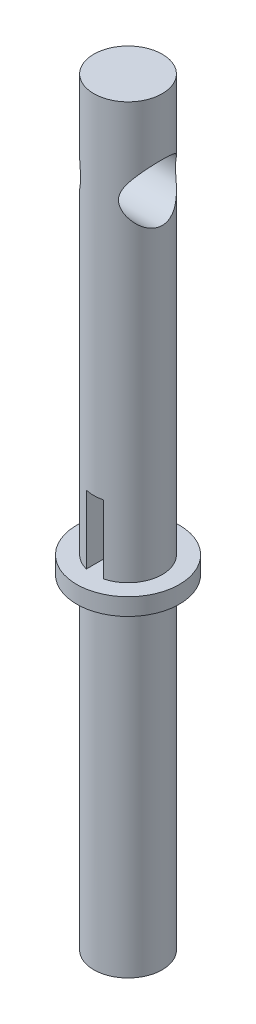
ISO-10303-21;
HEADER;
FILE_DESCRIPTION(('STEP AP214'),'2;1');
FILE_NAME('part.step','',(''),(''),'','','');
FILE_SCHEMA(('AUTOMOTIVE_DESIGN { 1 0 10303 214 1 1 1 1 }'));
ENDSEC;
DATA;
#1=APPLICATION_CONTEXT('core data for automotive mechanical design processes');
#2=APPLICATION_PROTOCOL_DEFINITION('international standard','automotive_design',2000,#1);
#3=PRODUCT_CONTEXT('',#1,'mechanical');
#4=PRODUCT('Part','Part','',(#3));
#5=PRODUCT_RELATED_PRODUCT_CATEGORY('part','',(#4));
#6=PRODUCT_DEFINITION_FORMATION('','',#4);
#7=PRODUCT_DEFINITION_CONTEXT('part definition',#1,'design');
#8=PRODUCT_DEFINITION('design','',#6,#7);
#9=PRODUCT_DEFINITION_SHAPE('','',#8);
#10=(LENGTH_UNIT() NAMED_UNIT(*) SI_UNIT(.MILLI.,.METRE.));
#11=(NAMED_UNIT(*) PLANE_ANGLE_UNIT() SI_UNIT($,.RADIAN.));
#12=(NAMED_UNIT(*) SI_UNIT($,.STERADIAN.) SOLID_ANGLE_UNIT());
#13=UNCERTAINTY_MEASURE_WITH_UNIT(LENGTH_MEASURE(1.E-05),#10,'distance_accuracy_value','');
#14=(GEOMETRIC_REPRESENTATION_CONTEXT(3) GLOBAL_UNCERTAINTY_ASSIGNED_CONTEXT((#13)) GLOBAL_UNIT_ASSIGNED_CONTEXT((#10,
#11,#12)) REPRESENTATION_CONTEXT('',''));
#15=CARTESIAN_POINT('',(0.,0.,0.));
#16=DIRECTION('',(0.,0.,1.));
#17=DIRECTION('',(1.,0.,0.));
#18=AXIS2_PLACEMENT_3D('',#15,#16,#17);
#19=CARTESIAN_POINT('',(0.,100.,0.));
#20=DIRECTION('',(0.,-1.,0.));
#21=DIRECTION('',(0.,0.,-1.));
#22=AXIS2_PLACEMENT_3D('',#19,#20,#21);
#23=CYLINDRICAL_SURFACE('',#22,6.);
#24=CARTESIAN_POINT('',(-3.3166247903554,118.,-5.));
#25=CARTESIAN_POINT('',(-3.31662794476975,118.088357331619,-4.99999873669809));
#26=CARTESIAN_POINT('',(-3.32017760246918,118.17674313147,-4.99764949990447));
#27=CARTESIAN_POINT('',(-3.33417045527444,118.352735942958,-4.98832325896171));
#28=CARTESIAN_POINT('',(-3.3446180998479,118.440342414908,-4.98134326778329));
#29=CARTESIAN_POINT('',(-3.38563021825916,118.701381115052,-4.95364903692459));
#30=CARTESIAN_POINT('',(-3.42586057200478,118.872671192586,-4.92618156230664));
#31=CARTESIAN_POINT('',(-3.5101558406814,119.15477857127,-4.8662676184845));
#32=CARTESIAN_POINT('',(-3.54929709438413,119.26808765609,-4.83790385903172));
#33=CARTESIAN_POINT('',(-3.63452822238789,119.490054140229,-4.77420588995433));
#34=CARTESIAN_POINT('',(-3.68061881422353,119.59871105771,-4.73887096042456));
#35=CARTESIAN_POINT('',(-3.77796853322909,119.811644554045,-4.66163300443267));
#36=CARTESIAN_POINT('',(-3.82924235518146,119.915907420314,-4.61971110606069));
#37=CARTESIAN_POINT('',(-3.93525823032698,120.119866277973,-4.52974410509653));
#38=CARTESIAN_POINT('',(-3.98999948308477,120.219563314267,-4.48170041311137));
#39=CARTESIAN_POINT('',(-4.12658292854895,120.458064552314,-4.35697668331641));
#40=CARTESIAN_POINT('',(-4.20963305622118,120.59450175216,-4.27707506631861));
#41=CARTESIAN_POINT('',(-4.37734960453414,120.858595640594,-4.10527119440744));
#42=CARTESIAN_POINT('',(-4.46201670619971,120.986248520416,-4.01336378337446));
#43=CARTESIAN_POINT('',(-4.63048997394915,121.232567906254,-3.81774867232316));
#44=CARTESIAN_POINT('',(-4.71429685905414,121.351242554597,-3.71405188298723));
#45=CARTESIAN_POINT('',(-4.87900188054922,121.579225014062,-3.49487447811016));
#46=CARTESIAN_POINT('',(-4.95990111064141,121.688536369009,-3.37939835739528));
#47=CARTESIAN_POINT('',(-5.16206895424223,121.95710777221,-3.06673100282964));
#48=CARTESIAN_POINT('',(-5.27982320972113,122.108976821495,-2.86071294008215));
#49=CARTESIAN_POINT('',(-5.4955407376141,122.382693706399,-2.42053048533954));
#50=CARTESIAN_POINT('',(-5.593536018849,122.504590168,-2.18641261186313));
#51=CARTESIAN_POINT('',(-5.74745712484945,122.69422711566,-1.7358252437812));
#52=CARTESIAN_POINT('',(-5.80772673614349,122.76768639697,-1.52329920748389));
#53=CARTESIAN_POINT('',(-5.88086312369275,122.856420576205,-1.19502628232578));
#54=CARTESIAN_POINT('',(-5.90236752178028,122.882427127586,-1.08398885378293));
#55=CARTESIAN_POINT('',(-5.93921712526113,122.926911634562,-0.859429029159067));
#56=CARTESIAN_POINT('',(-5.95456484023729,122.945392657753,-0.745907665517421));
#57=CARTESIAN_POINT('',(-5.97882939527611,122.9745820386,-0.516669986290209));
#58=CARTESIAN_POINT('',(-5.98771730317482,122.985255428814,-0.400946149218998));
#59=CARTESIAN_POINT('',(-5.99875382699587,122.998505894175,-0.168711507254269));
#60=CARTESIAN_POINT('',(-6.00090242912464,123.001082952753,-0.0522007007505217));
#61=CARTESIAN_POINT('',(-5.99841018407049,122.998092172682,0.180640612720631));
#62=CARTESIAN_POINT('',(-5.99376943883931,122.99252445634,0.296971122369191));
#63=CARTESIAN_POINT('',(-5.97780528304919,122.973347373147,0.528497640320092));
#64=CARTESIAN_POINT('',(-5.96648210073922,122.959738280963,0.643693687235134));
#65=CARTESIAN_POINT('',(-5.93838432928764,122.925900046649,0.864356619363596));
#66=CARTESIAN_POINT('',(-5.9220290408177,122.906179448638,0.969955578180804));
#67=CARTESIAN_POINT('',(-5.88402713952791,122.860240700624,1.1787736925959));
#68=CARTESIAN_POINT('',(-5.86237875386122,122.834020373589,1.28199203813953));
#69=CARTESIAN_POINT('',(-5.79004001335747,122.746123542295,1.58714445298207));
#70=CARTESIAN_POINT('',(-5.73193253821424,122.675183145112,1.78475392929081));
#71=CARTESIAN_POINT('',(-5.59380617850915,122.504815449882,2.18109489736997));
#72=CARTESIAN_POINT('',(-5.51233775066247,122.403469887338,2.37847529507846));
#73=CARTESIAN_POINT('',(-5.33487872344963,122.179193176341,2.75357057398256));
#74=CARTESIAN_POINT('',(-5.23887508225461,122.056242626577,2.93126754359993));
#75=CARTESIAN_POINT('',(-5.06345256362711,121.826552681739,3.22215723430855));
#76=CARTESIAN_POINT('',(-4.98626319074506,121.723983814923,3.34006525019963));
#77=CARTESIAN_POINT('',(-4.82829724388018,121.509659563431,3.56460009113998));
#78=CARTESIAN_POINT('',(-4.74752055452731,121.397903883205,3.67122655299482));
#79=CARTESIAN_POINT('',(-4.58410798881026,121.165577762687,3.87335486662883));
#80=CARTESIAN_POINT('',(-4.50146897844421,121.044991553801,3.96883598706688));
#81=CARTESIAN_POINT('',(-4.33655118512333,120.79543654578,4.14839258047199));
#82=CARTESIAN_POINT('',(-4.25427228300422,120.666470785426,4.23247215435344));
#83=CARTESIAN_POINT('',(-4.1140537410506,120.435458883206,4.36822595130953));
#84=CARTESIAN_POINT('',(-4.05545922530511,120.335372164501,4.42257235849338));
#85=CARTESIAN_POINT('',(-3.94102466938531,120.130470943921,4.52484320866562));
#86=CARTESIAN_POINT('',(-3.88518394975591,120.025657620601,4.57276924083878));
#87=CARTESIAN_POINT('',(-3.77786515537514,119.811310149254,4.6618221652177));
#88=CARTESIAN_POINT('',(-3.72637785846063,119.701786761803,4.7029636149486));
#89=CARTESIAN_POINT('',(-3.62953832593278,119.477757684949,4.77809629923187));
#90=CARTESIAN_POINT('',(-3.58418315976846,119.363254410268,4.81209095358585));
#91=CARTESIAN_POINT('',(-3.48752939102618,119.088380736585,4.88281523848206));
#92=CARTESIAN_POINT('',(-3.43964173138412,118.925897664081,4.91639072302862));
#93=CARTESIAN_POINT('',(-3.3840294682241,118.67691440476,4.95467936927281));
#94=CARTESIAN_POINT('',(-3.36819980713385,118.593094427593,4.96542704017027));
#95=CARTESIAN_POINT('',(-3.34259187408394,118.424119901189,4.98270218202997));
#96=CARTESIAN_POINT('',(-3.33281063445973,118.338966027492,4.98923172269279));
#97=CARTESIAN_POINT('',(-3.31972939847515,118.167284205897,4.99794561301055));
#98=CARTESIAN_POINT('',(-3.31647910249414,118.080750735018,5.00009664387433));
#99=CARTESIAN_POINT('',(-3.31678052916364,117.907702623172,4.99989668987805));
#100=CARTESIAN_POINT('',(-3.32033209207776,117.82118798181,4.99754581074186));
#101=CARTESIAN_POINT('',(-3.33405478268835,117.648845329324,4.98840108067787));
#102=CARTESIAN_POINT('',(-3.3442323451194,117.563018067842,4.98160291080297));
#103=CARTESIAN_POINT('',(-3.37071006080502,117.392735068692,4.96372506243882));
#104=CARTESIAN_POINT('',(-3.38701365331434,117.308280129305,4.95264297878864));
#105=CARTESIAN_POINT('',(-3.42981531688948,117.120231607996,4.92312920097745));
#106=CARTESIAN_POINT('',(-3.45784615150595,117.017167689583,4.90354996537012));
#107=CARTESIAN_POINT('',(-3.52082821574175,116.814446746996,4.85852481786918));
#108=CARTESIAN_POINT('',(-3.55578533317365,116.714792706558,4.83307391160853));
#109=CARTESIAN_POINT('',(-3.63118441347009,116.518885870487,4.77668497524491));
#110=CARTESIAN_POINT('',(-3.67164057148062,116.422642718162,4.74573267813381));
#111=CARTESIAN_POINT('',(-3.75661784436826,116.233852669996,4.67875547309408));
#112=CARTESIAN_POINT('',(-3.8011378410032,116.141304767354,4.6427319591363));
#113=CARTESIAN_POINT('',(-3.9193288291265,115.908046953392,4.54397265387661));
#114=CARTESIAN_POINT('',(-3.99516418797812,115.769919398337,4.47770636941178));
#115=CARTESIAN_POINT('',(-4.15071747665806,115.501932122123,4.33391164170773));
#116=CARTESIAN_POINT('',(-4.23043739702728,115.37207672014,4.25637738328216));
#117=CARTESIAN_POINT('',(-4.39127806383227,115.120294254834,4.09024004761838));
#118=CARTESIAN_POINT('',(-4.47240035029541,114.998376714554,4.00162403459399));
#119=CARTESIAN_POINT('',(-4.63384848035869,114.762731735844,3.81350438629227));
#120=CARTESIAN_POINT('',(-4.71417447436776,114.649002724275,3.71400285158992));
#121=CARTESIAN_POINT('',(-4.87425051167097,114.427277378878,3.50140550373499));
#122=CARTESIAN_POINT('',(-4.95393296540457,114.319502834655,3.38802651923032));
#123=CARTESIAN_POINT('',(-5.10871337759375,114.113671449091,3.14979793373936));
#124=CARTESIAN_POINT('',(-5.1838104886944,114.015616401804,3.02494622324846));
#125=CARTESIAN_POINT('',(-5.32734082462683,113.830592947242,2.7643281899541));
#126=CARTESIAN_POINT('',(-5.39579241721445,113.743593763711,2.62859396116225));
#127=CARTESIAN_POINT('',(-5.52435553294335,113.581751703963,2.34638028849616));
#128=CARTESIAN_POINT('',(-5.58447198962522,113.50690163221,2.19990728004665));
#129=CARTESIAN_POINT('',(-5.67617962065393,113.393512899591,1.94745044116202));
#130=CARTESIAN_POINT('',(-5.71061150195714,113.351173133296,1.84418602584183));
#131=CARTESIAN_POINT('',(-5.77435694644316,113.273086882035,1.6336724739409));
#132=CARTESIAN_POINT('',(-5.80367190661344,113.237338597356,1.52642443467048));
#133=CARTESIAN_POINT('',(-5.85665652035681,113.17291380295,1.30849019874867));
#134=CARTESIAN_POINT('',(-5.88032771684104,113.144235360373,1.19780495114685));
#135=CARTESIAN_POINT('',(-5.92156299248418,113.094380295454,0.973686630752035));
#136=CARTESIAN_POINT('',(-5.93912985749711,113.07320025096,0.860254836759139));
#137=CARTESIAN_POINT('',(-5.96787674727979,113.038584222936,0.630783080696449));
#138=CARTESIAN_POINT('',(-5.97902233359909,113.025189992737,0.514732461396216));
#139=CARTESIAN_POINT('',(-5.9945277383302,113.006565361142,0.281570670545718));
#140=CARTESIAN_POINT('',(-5.99889027069058,113.001331694644,0.164459942026936));
#141=CARTESIAN_POINT('',(-6.00073725326668,112.999115279661,-0.0699121411589829));
#142=CARTESIAN_POINT('',(-5.99822064385191,113.002133802304,-0.187173516250183));
#143=CARTESIAN_POINT('',(-5.98636592157636,113.016367555496,-0.420843634561557));
#144=CARTESIAN_POINT('',(-5.97702808694249,113.027582451727,-0.53725241236222));
#145=CARTESIAN_POINT('',(-5.95266735271363,113.056892667466,-0.759836291993555));
#146=CARTESIAN_POINT('',(-5.93811010610557,113.07442488611,-0.866137262020909));
#147=CARTESIAN_POINT('',(-5.90359345775074,113.116092798666,-1.07655589912361));
#148=CARTESIAN_POINT('',(-5.8836323337842,113.140230597807,-1.18067285873536));
#149=CARTESIAN_POINT('',(-5.81615311526212,113.222070719172,-1.48877367881909));
#150=CARTESIAN_POINT('',(-5.76101886378346,113.289223927613,-1.68868566836377));
#151=CARTESIAN_POINT('',(-5.62928736591246,113.451235770944,-2.08770893335346));
#152=CARTESIAN_POINT('',(-5.55142386318964,113.547750060002,-2.28571139482501));
#153=CARTESIAN_POINT('',(-5.38078021290574,113.762423360407,-2.66271401761202));
#154=CARTESIAN_POINT('',(-5.28798857113482,113.880599060226,-2.84169935856695));
#155=CARTESIAN_POINT('',(-5.11764052278972,114.102071147992,-3.13537854219948));
#156=CARTESIAN_POINT('',(-5.04243215748708,114.201196026972,-3.25465683969472));
#157=CARTESIAN_POINT('',(-4.88807269926615,114.408612723105,-3.48218762121494));
#158=CARTESIAN_POINT('',(-4.80892152227757,114.51690473576,-3.59043986998786));
#159=CARTESIAN_POINT('',(-4.64829669559423,114.74225136513,-3.79610354841702));
#160=CARTESIAN_POINT('',(-4.56681845260902,114.859324177984,-3.89349136454398));
#161=CARTESIAN_POINT('',(-4.4036448915909,115.101701356768,-4.07712890054708));
#162=CARTESIAN_POINT('',(-4.32194964830251,115.227003171425,-4.1633820481851));
#163=CARTESIAN_POINT('',(-4.17813106947155,115.457748618697,-4.30711013423563));
#164=CARTESIAN_POINT('',(-4.11561154336174,115.561592522764,-4.36676620571679));
#165=CARTESIAN_POINT('',(-3.99314168453422,115.774516514727,-4.47903059796963));
#166=CARTESIAN_POINT('',(-3.93319164260328,115.883597192319,-4.53163812248679));
#167=CARTESIAN_POINT('',(-3.81764974603368,116.106971138512,-4.62939117572733));
#168=CARTESIAN_POINT('',(-3.7620486836104,116.221252536595,-4.67455270718897));
#169=CARTESIAN_POINT('',(-3.65718908304626,116.455332200692,-4.75703840843708));
#170=CARTESIAN_POINT('',(-3.60792687428371,116.575127218884,-4.79436712192207));
#171=CARTESIAN_POINT('',(-3.50393713411263,116.85974301565,-4.87112383115559));
#172=CARTESIAN_POINT('',(-3.45249622153167,117.026715860445,-4.90740860229219));
#173=CARTESIAN_POINT('',(-3.39225340367089,117.282873939422,-4.94906155040725));
#174=CARTESIAN_POINT('',(-3.37500354661876,117.369095607749,-4.96080991746183));
#175=CARTESIAN_POINT('',(-3.34685992066568,117.54304020515,-4.97984154687568));
#176=CARTESIAN_POINT('',(-3.33596181327638,117.63076206728,-4.98712785716359));
#177=CARTESIAN_POINT('',(-3.32457244302594,117.765576628857,-4.99472098046215));
#178=CARTESIAN_POINT('',(-3.32159733493985,117.812382029319,-4.99669862748169));
#179=CARTESIAN_POINT('',(-3.3176224863153,117.906122259661,-4.9993385955846));
#180=CARTESIAN_POINT('',(-3.31662311446369,117.953057112062,-5.00000067117283));
#181=CARTESIAN_POINT('',(-3.3166247903554,118.,-5.));
#182=B_SPLINE_CURVE_WITH_KNOTS('',3,(#24,#25,#26,#27,#28,#29,#30,#31,#32,#33,#34,#35,#36,#37,
#38,#39,#40,#41,#42,#43,#44,#45,#46,#47,#48,#49,#50,#51,#52,#53,#54,#55,#56,#57,#58,#59,#60,#61,
#62,#63,#64,#65,#66,#67,#68,#69,#70,#71,#72,#73,#74,#75,#76,#77,#78,#79,#80,#81,#82,#83,#84,#85,
#86,#87,#88,#89,#90,#91,#92,#93,#94,#95,#96,#97,#98,#99,#100,#101,#102,#103,#104,#105,#106,#107,
#108,#109,#110,#111,#112,#113,#114,#115,#116,#117,#118,#119,#120,#121,#122,#123,#124,#125,#126,
#127,#128,#129,#130,#131,#132,#133,#134,#135,#136,#137,#138,#139,#140,#141,#142,#143,#144,#145,
#146,#147,#148,#149,#150,#151,#152,#153,#154,#155,#156,#157,#158,#159,#160,#161,#162,#163,#164,
#165,#166,#167,#168,#169,#170,#171,#172,#173,#174,#175,#176,#177,#178,#179,#180,#181),
.UNSPECIFIED.,.T.,.F.,(4,2,2,2,2,2,2,2,2,2,2,2,2,2,2,2,2,2,2,2,2,2,2,2,2,2,2,2,2,2,2,2,2,2,2,2,
2,2,2,2,2,2,2,2,2,2,2,2,2,2,2,2,2,2,2,2,2,2,2,2,2,2,2,2,2,2,2,2,2,2,2,2,2,2,2,2,2,2,4),(0.,
0.26501395281901,0.530199017087531,1.06163719911786,1.43076789442494,1.79993672943004,
2.17018320936787,2.54034452945808,3.07543019863954,3.61074643087442,4.14557121755988,
4.68019268072497,5.52201270319165,6.36245785313038,7.05764252128531,7.40543000351037,
7.75307557644038,8.10226874637167,8.45146263100875,8.80065127205551,9.14982798671478,
9.47544830739571,9.80117783968312,10.452097720823,11.1587200789086,11.8659802583275,
12.3882608741328,12.9105582989455,13.433812263902,13.9568775225451,14.3408709272065,
14.7247691086984,15.1078325378949,15.4907122487077,16.0066331878932,16.2642904978429,
16.5218212874357,16.7813045706502,17.0407817601757,17.3005113135066,17.5603869017104,
17.8856330794899,18.2111569341447,18.5375376410063,18.863828807222,19.3759116451388,
19.8882597039456,20.4012115116443,20.9140645092449,21.4400687075238,21.9661698171289,
22.4907727486829,23.0150638316062,23.3651335641894,23.7151075730876,24.0649857949239,
24.4147041313182,24.7662810155411,25.1177171950979,25.4692075112737,25.8206834915196,
26.1464577543446,26.4723359641474,27.1235556931919,27.8219883018054,28.5209612788415,
29.0374312101589,29.5539121585846,30.0714946488292,30.5889174215277,30.9939304204943,
31.3989891341328,31.8031656262596,32.2071070096085,32.7401711696446,33.0060225378416,
33.2716921059159,33.4124636663662,33.5532614933412),.UNSPECIFIED.);
#183=CARTESIAN_POINT('',(-3.3166247903554,118.,-5.));
#184=VERTEX_POINT('',#183);
#185=EDGE_CURVE('E50',#184,#184,#182,.T.);
#186=ORIENTED_EDGE('',*,*,#185,.T.);
#187=EDGE_LOOP('',(#186));
#188=FACE_BOUND('',#187,.T.);
#189=CARTESIAN_POINT('',(3.3166247903554,118.,-5.));
#190=CARTESIAN_POINT('',(3.31662794476975,117.911642668381,-4.99999873669809));
#191=CARTESIAN_POINT('',(3.32017760246918,117.82325686853,-4.99764949990447));
#192=CARTESIAN_POINT('',(3.33417045527444,117.647264057042,-4.98832325896171));
#193=CARTESIAN_POINT('',(3.3446180998479,117.559657585092,-4.98134326778329));
#194=CARTESIAN_POINT('',(3.38563021825916,117.298618884948,-4.95364903692459));
#195=CARTESIAN_POINT('',(3.42586057200478,117.127328807414,-4.92618156230664));
#196=CARTESIAN_POINT('',(3.5101558406814,116.84522142873,-4.8662676184845));
#197=CARTESIAN_POINT('',(3.54929709438413,116.73191234391,-4.83790385903172));
#198=CARTESIAN_POINT('',(3.63452822238789,116.509945859771,-4.77420588995433));
#199=CARTESIAN_POINT('',(3.68061881422353,116.40128894229,-4.73887096042456));
#200=CARTESIAN_POINT('',(3.7779685332291,116.188355445955,-4.66163300443266));
#201=CARTESIAN_POINT('',(3.82924235518147,116.084092579686,-4.61971110606068));
#202=CARTESIAN_POINT('',(3.93525823032699,115.880133722027,-4.52974410509652));
#203=CARTESIAN_POINT('',(3.98999948308478,115.780436685733,-4.48170041311136));
#204=CARTESIAN_POINT('',(4.12658292854895,115.541935447686,-4.35697668331641));
#205=CARTESIAN_POINT('',(4.20963305622118,115.40549824784,-4.27707506631861));
#206=CARTESIAN_POINT('',(4.37734960453414,115.141404359406,-4.10527119440744));
#207=CARTESIAN_POINT('',(4.46201670619972,115.013751479584,-4.01336378337446));
#208=CARTESIAN_POINT('',(4.63048997394915,114.767432093746,-3.81774867232316));
#209=CARTESIAN_POINT('',(4.71429685905414,114.648757445403,-3.71405188298723));
#210=CARTESIAN_POINT('',(4.87900188054922,114.420774985938,-3.49487447811017));
#211=CARTESIAN_POINT('',(4.9599011106414,114.311463630991,-3.37939835739529));
#212=CARTESIAN_POINT('',(5.16206895424223,114.04289222779,-3.06673100282964));
#213=CARTESIAN_POINT('',(5.27982320972113,113.891023178505,-2.86071294008215));
#214=CARTESIAN_POINT('',(5.4955407376141,113.617306293601,-2.42053048533954));
#215=CARTESIAN_POINT('',(5.593536018849,113.495409832,-2.18641261186313));
#216=CARTESIAN_POINT('',(5.74745712484945,113.30577288434,-1.7358252437812));
#217=CARTESIAN_POINT('',(5.80772673614349,113.23231360303,-1.52329920748389));
#218=CARTESIAN_POINT('',(5.88086312369275,113.143579423795,-1.19502628232578));
#219=CARTESIAN_POINT('',(5.90236752178028,113.117572872414,-1.08398885378294));
#220=CARTESIAN_POINT('',(5.93921712526113,113.073088365438,-0.859429029159074));
#221=CARTESIAN_POINT('',(5.95456484023729,113.054607342247,-0.745907665517424));
#222=CARTESIAN_POINT('',(5.97882939527611,113.0254179614,-0.51666998629021));
#223=CARTESIAN_POINT('',(5.98771730317482,113.014744571186,-0.400946149218999));
#224=CARTESIAN_POINT('',(5.99875382699587,113.001494105825,-0.168711507254271));
#225=CARTESIAN_POINT('',(6.00090242912464,112.998917047247,-0.0522007007505222));
#226=CARTESIAN_POINT('',(5.99841018407049,113.001907827318,0.180640612720631));
#227=CARTESIAN_POINT('',(5.99376943883931,113.00747554366,0.296971122369191));
#228=CARTESIAN_POINT('',(5.97780528304919,113.026652626853,0.528497640320092));
#229=CARTESIAN_POINT('',(5.96648210073922,113.040261719037,0.643693687235134));
#230=CARTESIAN_POINT('',(5.93838432928764,113.074099953351,0.864356619363596));
#231=CARTESIAN_POINT('',(5.9220290408177,113.093820551362,0.969955578180805));
#232=CARTESIAN_POINT('',(5.88402713952791,113.139759299376,1.1787736925959));
#233=CARTESIAN_POINT('',(5.86237875386122,113.165979626411,1.28199203813953));
#234=CARTESIAN_POINT('',(5.79004001335747,113.253876457705,1.58714445298207));
#235=CARTESIAN_POINT('',(5.73193253821424,113.324816854888,1.78475392929081));
#236=CARTESIAN_POINT('',(5.59380617850915,113.495184550118,2.18109489736997));
#237=CARTESIAN_POINT('',(5.51233775066246,113.596530112662,2.37847529507848));
#238=CARTESIAN_POINT('',(5.33487872344962,113.820806823659,2.75357057398257));
#239=CARTESIAN_POINT('',(5.23887508225461,113.943757373423,2.93126754359993));
#240=CARTESIAN_POINT('',(5.0634525636271,114.173447318261,3.22215723430856));
#241=CARTESIAN_POINT('',(4.98626319074505,114.276016185078,3.34006525019965));
#242=CARTESIAN_POINT('',(4.82829724388017,114.490340436569,3.56460009113999));
#243=CARTESIAN_POINT('',(4.74752055452731,114.602096116796,3.67122655299483));
#244=CARTESIAN_POINT('',(4.58410798881026,114.834422237313,3.87335486662883));
#245=CARTESIAN_POINT('',(4.50146897844421,114.955008446199,3.96883598706688));
#246=CARTESIAN_POINT('',(4.33655118512333,115.20456345422,4.14839258047199));
#247=CARTESIAN_POINT('',(4.25427228300422,115.333529214574,4.23247215435344));
#248=CARTESIAN_POINT('',(4.1140537410506,115.564541116794,4.36822595130953));
#249=CARTESIAN_POINT('',(4.05545922530511,115.664627835499,4.42257235849338));
#250=CARTESIAN_POINT('',(3.9410246693853,115.869529056079,4.52484320866562));
#251=CARTESIAN_POINT('',(3.88518394975591,115.974342379399,4.57276924083878));
#252=CARTESIAN_POINT('',(3.77786515537514,116.188689850746,4.66182216521771));
#253=CARTESIAN_POINT('',(3.72637785846063,116.298213238197,4.7029636149486));
#254=CARTESIAN_POINT('',(3.62953832593278,116.522242315051,4.77809629923188));
#255=CARTESIAN_POINT('',(3.58418315976846,116.636745589732,4.81209095358585));
#256=CARTESIAN_POINT('',(3.48752939102619,116.911619263415,4.88281523848206));
#257=CARTESIAN_POINT('',(3.43964173138412,117.074102335919,4.91639072302862));
#258=CARTESIAN_POINT('',(3.38402946822411,117.32308559524,4.9546793692728));
#259=CARTESIAN_POINT('',(3.36819980713385,117.406905572407,4.96542704017027));
#260=CARTESIAN_POINT('',(3.34259187408394,117.575880098811,4.98270218202997));
#261=CARTESIAN_POINT('',(3.33281063445973,117.661033972508,4.98923172269279));
#262=CARTESIAN_POINT('',(3.31972939847515,117.832715794103,4.99794561301055));
#263=CARTESIAN_POINT('',(3.31647910249414,117.919249264982,5.00009664387433));
#264=CARTESIAN_POINT('',(3.31678052916364,118.092297376828,4.99989668987805));
#265=CARTESIAN_POINT('',(3.32033209207776,118.17881201819,4.99754581074186));
#266=CARTESIAN_POINT('',(3.33405478268835,118.351154670676,4.98840108067787));
#267=CARTESIAN_POINT('',(3.34423234511941,118.436981932158,4.98160291080297));
#268=CARTESIAN_POINT('',(3.37071006080502,118.607264931308,4.96372506243882));
#269=CARTESIAN_POINT('',(3.38701365331434,118.691719870695,4.95264297878864));
#270=CARTESIAN_POINT('',(3.42981531688948,118.879768392004,4.92312920097745));
#271=CARTESIAN_POINT('',(3.45784615150596,118.982832310417,4.90354996537012));
#272=CARTESIAN_POINT('',(3.52082821574176,119.185553253004,4.85852481786918));
#273=CARTESIAN_POINT('',(3.55578533317365,119.285207293442,4.83307391160853));
#274=CARTESIAN_POINT('',(3.63118441347009,119.481114129513,4.77668497524491));
#275=CARTESIAN_POINT('',(3.67164057148062,119.577357281838,4.74573267813381));
#276=CARTESIAN_POINT('',(3.75661784436826,119.766147330004,4.67875547309408));
#277=CARTESIAN_POINT('',(3.8011378410032,119.858695232646,4.6427319591363));
#278=CARTESIAN_POINT('',(3.91932882912651,120.091953046608,4.54397265387661));
#279=CARTESIAN_POINT('',(3.99516418797813,120.230080601663,4.47770636941177));
#280=CARTESIAN_POINT('',(4.15071747665807,120.498067877877,4.33391164170772));
#281=CARTESIAN_POINT('',(4.23043739702728,120.62792327986,4.25637738328216));
#282=CARTESIAN_POINT('',(4.39127806383227,120.879705745166,4.09024004761838));
#283=CARTESIAN_POINT('',(4.47240035029541,121.001623285446,4.00162403459399));
#284=CARTESIAN_POINT('',(4.63384848035869,121.237268264156,3.81350438629227));
#285=CARTESIAN_POINT('',(4.71417447436776,121.350997275725,3.71400285158992));
#286=CARTESIAN_POINT('',(4.87425051167097,121.572722621122,3.50140550373499));
#287=CARTESIAN_POINT('',(4.95393296540457,121.680497165345,3.38802651923032));
#288=CARTESIAN_POINT('',(5.10871337759374,121.886328550909,3.14979793373936));
#289=CARTESIAN_POINT('',(5.1838104886944,121.984383598196,3.02494622324846));
#290=CARTESIAN_POINT('',(5.32734082462683,122.169407052758,2.7643281899541));
#291=CARTESIAN_POINT('',(5.39579241721445,122.256406236289,2.62859396116225));
#292=CARTESIAN_POINT('',(5.52435553294336,122.418248296037,2.34638028849616));
#293=CARTESIAN_POINT('',(5.58447198962522,122.49309836779,2.19990728004665));
#294=CARTESIAN_POINT('',(5.67617962065393,122.606487100409,1.94745044116201));
#295=CARTESIAN_POINT('',(5.71061150195714,122.648826866704,1.84418602584183));
#296=CARTESIAN_POINT('',(5.77435694644317,122.726913117965,1.6336724739409));
#297=CARTESIAN_POINT('',(5.80367190661344,122.762661402644,1.52642443467048));
#298=CARTESIAN_POINT('',(5.85665652035681,122.82708619705,1.30849019874867));
#299=CARTESIAN_POINT('',(5.88032771684104,122.855764639627,1.19780495114686));
#300=CARTESIAN_POINT('',(5.92156299248418,122.905619704546,0.973686630752041));
#301=CARTESIAN_POINT('',(5.93912985749711,122.92679974904,0.860254836759142));
#302=CARTESIAN_POINT('',(5.96787674727979,122.961415777064,0.630783080696449));
#303=CARTESIAN_POINT('',(5.97902233359909,122.974810007263,0.514732461396215));
#304=CARTESIAN_POINT('',(5.9945277383302,122.993434638858,0.281570670545717));
#305=CARTESIAN_POINT('',(5.99889027069058,122.998668305356,0.164459942026936));
#306=CARTESIAN_POINT('',(6.00073725326668,123.000884720339,-0.0699121411589829));
#307=CARTESIAN_POINT('',(5.99822064385191,122.997866197696,-0.187173516250183));
#308=CARTESIAN_POINT('',(5.98636592157636,122.983632444504,-0.420843634561557));
#309=CARTESIAN_POINT('',(5.97702808694249,122.972417548273,-0.53725241236222));
#310=CARTESIAN_POINT('',(5.95266735271363,122.943107332534,-0.759836291993555));
#311=CARTESIAN_POINT('',(5.93811010610557,122.92557511389,-0.866137262020911));
#312=CARTESIAN_POINT('',(5.90359345775074,122.883907201334,-1.07655589912361));
#313=CARTESIAN_POINT('',(5.8836323337842,122.859769402193,-1.18067285873536));
#314=CARTESIAN_POINT('',(5.81615311526212,122.777929280828,-1.48877367881909));
#315=CARTESIAN_POINT('',(5.76101886378346,122.710776072387,-1.68868566836377));
#316=CARTESIAN_POINT('',(5.62928736591246,122.548764229056,-2.08770893335346));
#317=CARTESIAN_POINT('',(5.55142386318964,122.452249939998,-2.28571139482501));
#318=CARTESIAN_POINT('',(5.38078021290574,122.237576639593,-2.66271401761202));
#319=CARTESIAN_POINT('',(5.28798857113482,122.119400939774,-2.84169935856695));
#320=CARTESIAN_POINT('',(5.11764052278972,121.897928852008,-3.13537854219948));
#321=CARTESIAN_POINT('',(5.04243215748708,121.798803973028,-3.25465683969472));
#322=CARTESIAN_POINT('',(4.88807269926616,121.591387276895,-3.48218762121493));
#323=CARTESIAN_POINT('',(4.80892152227758,121.48309526424,-3.59043986998785));
#324=CARTESIAN_POINT('',(4.64829669559424,121.25774863487,-3.79610354841701));
#325=CARTESIAN_POINT('',(4.56681845260902,121.140675822016,-3.89349136454398));
#326=CARTESIAN_POINT('',(4.4036448915909,120.898298643232,-4.07712890054708));
#327=CARTESIAN_POINT('',(4.32194964830251,120.772996828575,-4.1633820481851));
#328=CARTESIAN_POINT('',(4.17813106947155,120.542251381303,-4.30711013423563));
#329=CARTESIAN_POINT('',(4.11561154336174,120.438407477236,-4.36676620571679));
#330=CARTESIAN_POINT('',(3.99314168453421,120.225483485273,-4.47903059796963));
#331=CARTESIAN_POINT('',(3.93319164260328,120.116402807681,-4.53163812248679));
#332=CARTESIAN_POINT('',(3.81764974603368,119.893028861488,-4.62939117572733));
#333=CARTESIAN_POINT('',(3.76204868361039,119.778747463405,-4.67455270718897));
#334=CARTESIAN_POINT('',(3.65718908304626,119.544667799308,-4.75703840843708));
#335=CARTESIAN_POINT('',(3.60792687428371,119.424872781116,-4.79436712192207));
#336=CARTESIAN_POINT('',(3.50393713411263,119.14025698435,-4.87112383115559));
#337=CARTESIAN_POINT('',(3.45249622153167,118.973284139555,-4.90740860229219));
#338=CARTESIAN_POINT('',(3.39225340367089,118.717126060578,-4.94906155040725));
#339=CARTESIAN_POINT('',(3.37500354661876,118.630904392251,-4.96080991746183));
#340=CARTESIAN_POINT('',(3.34685992066568,118.45695979485,-4.97984154687568));
#341=CARTESIAN_POINT('',(3.33596181327638,118.36923793272,-4.98712785716359));
#342=CARTESIAN_POINT('',(3.32457244302594,118.234423371143,-4.99472098046215));
#343=CARTESIAN_POINT('',(3.32159733493985,118.187617970681,-4.99669862748169));
#344=CARTESIAN_POINT('',(3.3176224863153,118.093877740339,-4.9993385955846));
#345=CARTESIAN_POINT('',(3.31662311446369,118.046942887938,-5.00000067117283));
#346=CARTESIAN_POINT('',(3.3166247903554,118.,-5.));
#347=B_SPLINE_CURVE_WITH_KNOTS('',3,(#189,#190,#191,#192,#193,#194,#195,#196,#197,#198,#199,
#200,#201,#202,#203,#204,#205,#206,#207,#208,#209,#210,#211,#212,#213,#214,#215,#216,#217,#218,
#219,#220,#221,#222,#223,#224,#225,#226,#227,#228,#229,#230,#231,#232,#233,#234,#235,#236,#237,
#238,#239,#240,#241,#242,#243,#244,#245,#246,#247,#248,#249,#250,#251,#252,#253,#254,#255,#256,
#257,#258,#259,#260,#261,#262,#263,#264,#265,#266,#267,#268,#269,#270,#271,#272,#273,#274,#275,
#276,#277,#278,#279,#280,#281,#282,#283,#284,#285,#286,#287,#288,#289,#290,#291,#292,#293,#294,
#295,#296,#297,#298,#299,#300,#301,#302,#303,#304,#305,#306,#307,#308,#309,#310,#311,#312,#313,
#314,#315,#316,#317,#318,#319,#320,#321,#322,#323,#324,#325,#326,#327,#328,#329,#330,#331,#332,
#333,#334,#335,#336,#337,#338,#339,#340,#341,#342,#343,#344,#345,#346),.UNSPECIFIED.,.T.,.F.,(4,
2,2,2,2,2,2,2,2,2,2,2,2,2,2,2,2,2,2,2,2,2,2,2,2,2,2,2,2,2,2,2,2,2,2,2,2,2,2,2,2,2,2,2,2,2,2,2,2,
2,2,2,2,2,2,2,2,2,2,2,2,2,2,2,2,2,2,2,2,2,2,2,2,2,2,2,2,2,4),(0.,0.26501395281901,
0.530199017087531,1.06163719911786,1.43076789442494,1.79993672943004,2.17018320936791,
2.54034452945808,3.07543019863954,3.61074643087442,4.14557121755986,4.68019268072496,
5.52201270319165,6.36245785313038,7.05764252128531,7.40543000351036,7.75307557644038,
8.10226874637167,8.45146263100875,8.80065127205551,9.14982798671478,9.47544830739571,
9.80117783968312,10.452097720823,11.1587200789087,11.8659802583275,12.3882608741328,
12.9105582989455,13.433812263902,13.9568775225451,14.3408709272065,14.7247691086984,
15.1078325378949,15.4907122487077,16.0066331878932,16.2642904978429,16.5218212874357,
16.7813045706502,17.0407817601757,17.3005113135067,17.5603869017104,17.8856330794899,
18.2111569341447,18.5375376410063,18.863828807222,19.3759116451388,19.8882597039456,
20.4012115116443,20.9140645092449,21.4400687075238,21.9661698171289,22.4907727486829,
23.0150638316062,23.3651335641894,23.7151075730876,24.0649857949239,24.4147041313182,
24.7662810155411,25.1177171950979,25.4692075112737,25.8206834915196,26.1464577543446,
26.4723359641474,27.1235556931919,27.8219883018054,28.5209612788415,29.0374312101588,
29.5539121585846,30.0714946488292,30.5889174215277,30.9939304204943,31.3989891341328,
31.8031656262596,32.2071070096085,32.7401711696445,33.0060225378416,33.2716921059159,
33.4124636663662,33.5532614933412),.UNSPECIFIED.);
#348=CARTESIAN_POINT('',(3.3166247903554,118.,-5.));
#349=VERTEX_POINT('',#348);
#350=EDGE_CURVE('E147',#349,#349,#347,.T.);
#351=ORIENTED_EDGE('',*,*,#350,.T.);
#352=EDGE_LOOP('',(#351));
#353=FACE_BOUND('',#352,.T.);
#354=CARTESIAN_POINT('',(0.,60.,0.));
#355=DIRECTION('',(0.,-1.,0.));
#356=DIRECTION('',(0.,0.,-1.));
#357=AXIS2_PLACEMENT_3D('',#354,#355,#356);
#358=CIRCLE('',#357,6.);
#359=CARTESIAN_POINT('',(1.5,60.,-5.80947501931113));
#360=VERTEX_POINT('',#359);
#361=CARTESIAN_POINT('',(1.5,60.,5.80947501931113));
#362=VERTEX_POINT('',#361);
#363=EDGE_CURVE('E113',#360,#362,#358,.T.);
#364=ORIENTED_EDGE('',*,*,#363,.F.);
#365=DIRECTION('',(0.,-1.,0.));
#366=VECTOR('',#365,1.);
#367=CARTESIAN_POINT('',(1.5,100.,-5.80947501931113));
#368=LINE('',#367,#366);
#369=CARTESIAN_POINT('',(1.5,72.,-5.80947501931113));
#370=VERTEX_POINT('',#369);
#371=EDGE_CURVE('E97',#360,#370,#368,.F.);
#372=ORIENTED_EDGE('',*,*,#371,.T.);
#373=CARTESIAN_POINT('',(0.,72.,0.));
#374=DIRECTION('',(0.,-1.,0.));
#375=DIRECTION('',(0.,0.,-1.));
#376=AXIS2_PLACEMENT_3D('',#373,#374,#375);
#377=CIRCLE('',#376,6.);
#378=CARTESIAN_POINT('',(-1.5,72.,-5.80947501931113));
#379=VERTEX_POINT('',#378);
#380=EDGE_CURVE('E106',#379,#370,#377,.T.);
#381=ORIENTED_EDGE('',*,*,#380,.F.);
#382=DIRECTION('',(0.,-1.,0.));
#383=VECTOR('',#382,1.);
#384=CARTESIAN_POINT('',(-1.5,100.,-5.80947501931113));
#385=LINE('',#384,#383);
#386=CARTESIAN_POINT('',(-1.5,60.,-5.80947501931113));
#387=VERTEX_POINT('',#386);
#388=EDGE_CURVE('E143',#387,#379,#385,.F.);
#389=ORIENTED_EDGE('',*,*,#388,.F.);
#390=CARTESIAN_POINT('',(-1.5,60.,5.80947501931113));
#391=VERTEX_POINT('',#390);
#392=EDGE_CURVE('E68',#391,#387,#358,.T.);
#393=ORIENTED_EDGE('',*,*,#392,.F.);
#394=DIRECTION('',(0.,-1.,0.));
#395=VECTOR('',#394,1.);
#396=CARTESIAN_POINT('',(-1.5,100.,5.80947501931113));
#397=LINE('',#396,#395);
#398=CARTESIAN_POINT('',(-1.5,72.,5.80947501931113));
#399=VERTEX_POINT('',#398);
#400=EDGE_CURVE('E11',#399,#391,#397,.T.);
#401=ORIENTED_EDGE('',*,*,#400,.F.);
#402=CARTESIAN_POINT('',(1.5,72.,5.80947501931113));
#403=VERTEX_POINT('',#402);
#404=EDGE_CURVE('E60',#403,#399,#377,.T.);
#405=ORIENTED_EDGE('',*,*,#404,.F.);
#406=DIRECTION('',(0.,-1.,0.));
#407=VECTOR('',#406,1.);
#408=CARTESIAN_POINT('',(1.5,100.,5.80947501931113));
#409=LINE('',#408,#407);
#410=EDGE_CURVE('E118',#403,#362,#409,.T.);
#411=ORIENTED_EDGE('',*,*,#410,.T.);
#412=EDGE_LOOP('',(#364,#372,#381,#389,#393,#401,#405,#411));
#413=FACE_BOUND('',#412,.T.);
#414=CARTESIAN_POINT('',(0.,133.,0.));
#415=DIRECTION('',(0.,1.,0.));
#416=DIRECTION('',(0.,0.,1.));
#417=AXIS2_PLACEMENT_3D('',#414,#415,#416);
#418=CIRCLE('',#417,6.);
#419=CARTESIAN_POINT('',(0.,133.,6.));
#420=VERTEX_POINT('',#419);
#421=EDGE_CURVE('E200',#420,#420,#418,.T.);
#422=ORIENTED_EDGE('',*,*,#421,.F.);
#423=EDGE_LOOP('',(#422));
#424=FACE_BOUND('',#423,.T.);
#425=ADVANCED_FACE('F45',(#188,#353,#413,#424),#23,.T.);
#426=CARTESIAN_POINT('',(0.,57.,0.));
#427=DIRECTION('',(0.,-1.,0.));
#428=DIRECTION('',(0.,0.,-1.));
#429=AXIS2_PLACEMENT_3D('',#426,#427,#428);
#430=CIRCLE('',#429,6.);
#431=CARTESIAN_POINT('',(0.,57.,-6.));
#432=VERTEX_POINT('',#431);
#433=EDGE_CURVE('E120',#432,#432,#430,.T.);
#434=ORIENTED_EDGE('',*,*,#433,.T.);
#435=EDGE_LOOP('',(#434));
#436=FACE_BOUND('',#435,.T.);
#437=CARTESIAN_POINT('',(0.,0.,0.));
#438=DIRECTION('',(0.,1.,0.));
#439=DIRECTION('',(0.,0.,1.));
#440=AXIS2_PLACEMENT_3D('',#437,#438,#439);
#441=CIRCLE('',#440,6.);
#442=CARTESIAN_POINT('',(0.,0.,6.));
#443=VERTEX_POINT('',#442);
#444=EDGE_CURVE('E107',#443,#443,#441,.T.);
#445=ORIENTED_EDGE('',*,*,#444,.T.);
#446=EDGE_LOOP('',(#445));
#447=FACE_BOUND('',#446,.T.);
#448=ADVANCED_FACE('F47',(#436,#447),#23,.T.);
#449=CARTESIAN_POINT('',(0.,0.,0.));
#450=DIRECTION('',(0.,1.,0.));
#451=DIRECTION('',(0.,0.,1.));
#452=AXIS2_PLACEMENT_3D('',#449,#450,#451);
#453=PLANE('',#452);
#454=ORIENTED_EDGE('',*,*,#444,.F.);
#455=EDGE_LOOP('',(#454));
#456=FACE_BOUND('',#455,.T.);
#457=ADVANCED_FACE('F171',(#456),#453,.F.);
#458=CARTESIAN_POINT('',(0.,57.,0.));
#459=DIRECTION('',(0.,1.,0.));
#460=DIRECTION('',(0.,0.,1.));
#461=AXIS2_PLACEMENT_3D('',#458,#459,#460);
#462=CYLINDRICAL_SURFACE('',#461,9.);
#463=CARTESIAN_POINT('',(0.,57.,0.));
#464=DIRECTION('',(0.,-1.,0.));
#465=DIRECTION('',(0.,0.,-1.));
#466=AXIS2_PLACEMENT_3D('',#463,#464,#465);
#467=CIRCLE('',#466,9.);
#468=CARTESIAN_POINT('',(0.,57.,-9.));
#469=VERTEX_POINT('',#468);
#470=EDGE_CURVE('E126',#469,#469,#467,.T.);
#471=ORIENTED_EDGE('',*,*,#470,.F.);
#472=EDGE_LOOP('',(#471));
#473=FACE_BOUND('',#472,.T.);
#474=CARTESIAN_POINT('',(0.,60.,0.));
#475=DIRECTION('',(0.,-1.,0.));
#476=DIRECTION('',(0.,0.,-1.));
#477=AXIS2_PLACEMENT_3D('',#474,#475,#476);
#478=CIRCLE('',#477,9.);
#479=CARTESIAN_POINT('',(0.,60.,-9.));
#480=VERTEX_POINT('',#479);
#481=EDGE_CURVE('E129',#480,#480,#478,.T.);
#482=ORIENTED_EDGE('',*,*,#481,.T.);
#483=EDGE_LOOP('',(#482));
#484=FACE_BOUND('',#483,.T.);
#485=ADVANCED_FACE('F167',(#473,#484),#462,.T.);
#486=CARTESIAN_POINT('',(0.,57.,0.));
#487=DIRECTION('',(0.,-1.,0.));
#488=DIRECTION('',(0.,0.,-1.));
#489=AXIS2_PLACEMENT_3D('',#486,#487,#488);
#490=PLANE('',#489);
#491=ORIENTED_EDGE('',*,*,#433,.F.);
#492=EDGE_LOOP('',(#491));
#493=FACE_BOUND('',#492,.T.);
#494=ORIENTED_EDGE('',*,*,#470,.T.);
#495=EDGE_LOOP('',(#494));
#496=FACE_BOUND('',#495,.T.);
#497=ADVANCED_FACE('F163',(#493,#496),#490,.T.);
#498=CARTESIAN_POINT('',(-1.5,72.,-50.));
#499=DIRECTION('',(0.,-1.,0.));
#500=DIRECTION('',(0.,0.,-1.));
#501=AXIS2_PLACEMENT_3D('',#498,#499,#500);
#502=PLANE('',#501);
#503=ORIENTED_EDGE('',*,*,#404,.T.);
#504=DIRECTION('',(0.,0.,1.));
#505=VECTOR('',#504,1.);
#506=CARTESIAN_POINT('',(-1.5,72.,-50.));
#507=LINE('',#506,#505);
#508=EDGE_CURVE('E135',#379,#399,#507,.T.);
#509=ORIENTED_EDGE('',*,*,#508,.F.);
#510=ORIENTED_EDGE('',*,*,#380,.T.);
#511=DIRECTION('',(0.,0.,1.));
#512=VECTOR('',#511,1.);
#513=CARTESIAN_POINT('',(1.5,72.,-50.));
#514=LINE('',#513,#512);
#515=EDGE_CURVE('E102',#370,#403,#514,.T.);
#516=ORIENTED_EDGE('',*,*,#515,.T.);
#517=EDGE_LOOP('',(#503,#509,#510,#516));
#518=FACE_BOUND('',#517,.T.);
#519=ADVANCED_FACE('F166',(#518),#502,.T.);
#520=CARTESIAN_POINT('',(-1.5,60.,-50.));
#521=DIRECTION('',(1.,0.,0.));
#522=DIRECTION('',(0.,1.,0.));
#523=AXIS2_PLACEMENT_3D('',#520,#521,#522);
#524=PLANE('',#523);
#525=ORIENTED_EDGE('',*,*,#400,.T.);
#526=DIRECTION('',(0.,0.,1.));
#527=VECTOR('',#526,1.);
#528=CARTESIAN_POINT('',(-1.5,60.,-50.));
#529=LINE('',#528,#527);
#530=EDGE_CURVE('E115',#387,#391,#529,.T.);
#531=ORIENTED_EDGE('',*,*,#530,.F.);
#532=ORIENTED_EDGE('',*,*,#388,.T.);
#533=ORIENTED_EDGE('',*,*,#508,.T.);
#534=EDGE_LOOP('',(#525,#531,#532,#533));
#535=FACE_BOUND('',#534,.T.);
#536=ADVANCED_FACE('F178',(#535),#524,.T.);
#537=CARTESIAN_POINT('',(1.5,60.,-50.));
#538=DIRECTION('',(1.,0.,0.));
#539=DIRECTION('',(0.,1.,0.));
#540=AXIS2_PLACEMENT_3D('',#537,#538,#539);
#541=PLANE('',#540);
#542=ORIENTED_EDGE('',*,*,#515,.F.);
#543=ORIENTED_EDGE('',*,*,#371,.F.);
#544=DIRECTION('',(0.,0.,1.));
#545=VECTOR('',#544,1.);
#546=CARTESIAN_POINT('',(1.5,60.,-50.));
#547=LINE('',#546,#545);
#548=EDGE_CURVE('E100',#360,#362,#547,.T.);
#549=ORIENTED_EDGE('',*,*,#548,.T.);
#550=ORIENTED_EDGE('',*,*,#410,.F.);
#551=EDGE_LOOP('',(#542,#543,#549,#550));
#552=FACE_BOUND('',#551,.T.);
#553=ADVANCED_FACE('F99',(#552),#541,.F.);
#554=CARTESIAN_POINT('',(-1.5,60.,-50.));
#555=DIRECTION('',(0.,-1.,0.));
#556=DIRECTION('',(0.,0.,-1.));
#557=AXIS2_PLACEMENT_3D('',#554,#555,#556);
#558=PLANE('',#557);
#559=ORIENTED_EDGE('',*,*,#530,.T.);
#560=ORIENTED_EDGE('',*,*,#392,.T.);
#561=EDGE_LOOP('',(#559,#560));
#562=FACE_BOUND('',#561,.T.);
#563=ORIENTED_EDGE('',*,*,#548,.F.);
#564=ORIENTED_EDGE('',*,*,#363,.T.);
#565=EDGE_LOOP('',(#563,#564));
#566=FACE_BOUND('',#565,.T.);
#567=ORIENTED_EDGE('',*,*,#481,.F.);
#568=EDGE_LOOP('',(#567));
#569=FACE_BOUND('',#568,.T.);
#570=ADVANCED_FACE('F111',(#562,#566,#569),#558,.F.);
#571=CARTESIAN_POINT('',(0.,133.,0.));
#572=DIRECTION('',(0.,1.,0.));
#573=DIRECTION('',(0.,0.,1.));
#574=AXIS2_PLACEMENT_3D('',#571,#572,#573);
#575=PLANE('',#574);
#576=ORIENTED_EDGE('',*,*,#421,.T.);
#577=EDGE_LOOP('',(#576));
#578=FACE_BOUND('',#577,.T.);
#579=ADVANCED_FACE('F157',(#578),#575,.T.);
#580=CARTESIAN_POINT('',(-27.5,118.,0.));
#581=DIRECTION('',(1.,0.,0.));
#582=DIRECTION('',(0.,0.,-1.));
#583=AXIS2_PLACEMENT_3D('',#580,#581,#582);
#584=CYLINDRICAL_SURFACE('',#583,5.);
#585=ORIENTED_EDGE('',*,*,#350,.F.);
#586=EDGE_LOOP('',(#585));
#587=FACE_BOUND('',#586,.T.);
#588=ORIENTED_EDGE('',*,*,#185,.F.);
#589=EDGE_LOOP('',(#588));
#590=FACE_BOUND('',#589,.T.);
#591=ADVANCED_FACE('F153',(#587,#590),#584,.F.);
#592=CLOSED_SHELL('',(#425,#448,#457,#485,#497,#519,#536,#553,#570,#579,#591));
#593=MANIFOLD_SOLID_BREP('B2',#592);
#594=ADVANCED_BREP_SHAPE_REPRESENTATION('',(#18,#593),#14);
#595=SHAPE_DEFINITION_REPRESENTATION(#9,#594);
ENDSEC;
END-ISO-10303-21;
